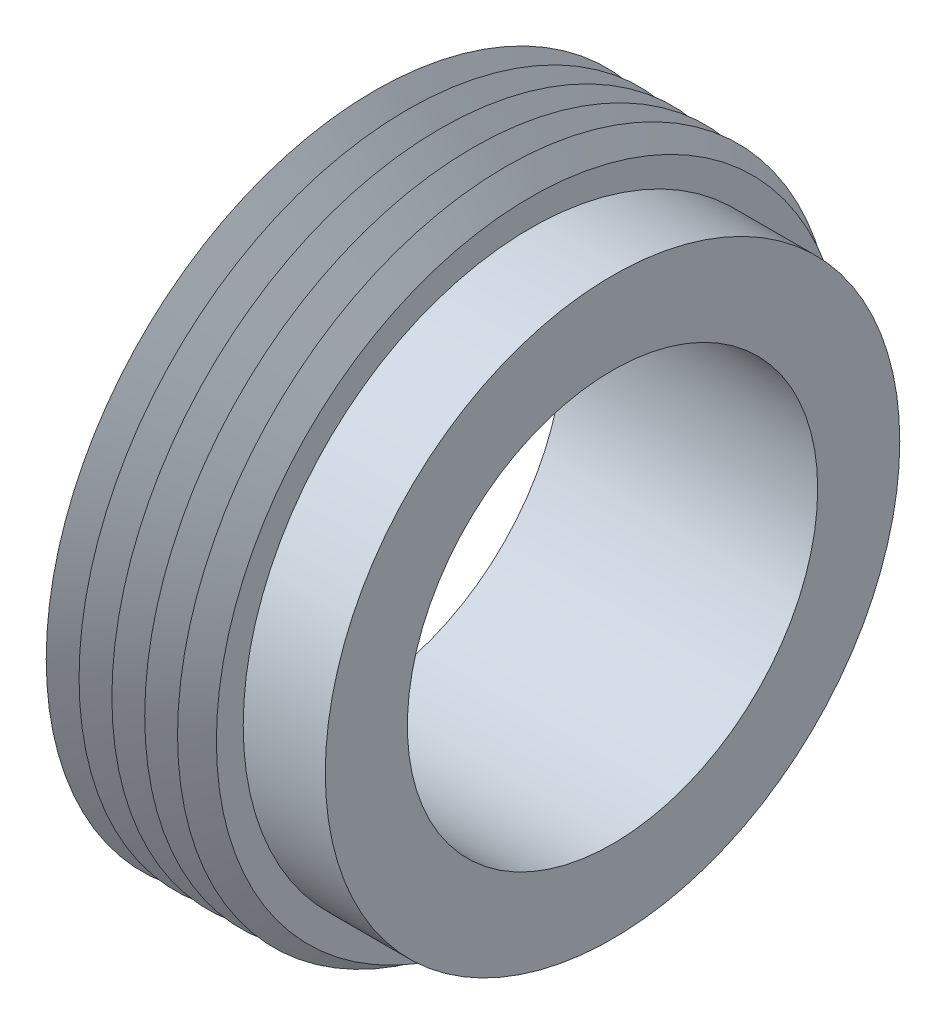
ISO-10303-21;
HEADER;
FILE_DESCRIPTION(('STEP AP214'),'2;1');
FILE_NAME('part.step','',(''),(''),'','','');
FILE_SCHEMA(('AUTOMOTIVE_DESIGN { 1 0 10303 214 1 1 1 1 }'));
ENDSEC;
DATA;
#1=APPLICATION_CONTEXT('core data for automotive mechanical design processes');
#2=APPLICATION_PROTOCOL_DEFINITION('international standard','automotive_design',2000,#1);
#3=PRODUCT_CONTEXT('',#1,'mechanical');
#4=PRODUCT('Part','Part','',(#3));
#5=PRODUCT_RELATED_PRODUCT_CATEGORY('part','',(#4));
#6=PRODUCT_DEFINITION_FORMATION('','',#4);
#7=PRODUCT_DEFINITION_CONTEXT('part definition',#1,'design');
#8=PRODUCT_DEFINITION('design','',#6,#7);
#9=PRODUCT_DEFINITION_SHAPE('','',#8);
#10=(LENGTH_UNIT() NAMED_UNIT(*) SI_UNIT(.MILLI.,.METRE.));
#11=(NAMED_UNIT(*) PLANE_ANGLE_UNIT() SI_UNIT($,.RADIAN.));
#12=(NAMED_UNIT(*) SI_UNIT($,.STERADIAN.) SOLID_ANGLE_UNIT());
#13=UNCERTAINTY_MEASURE_WITH_UNIT(LENGTH_MEASURE(1.E-05),#10,'distance_accuracy_value','');
#14=(GEOMETRIC_REPRESENTATION_CONTEXT(3) GLOBAL_UNCERTAINTY_ASSIGNED_CONTEXT((#13)) GLOBAL_UNIT_ASSIGNED_CONTEXT((#10,
#11,#12)) REPRESENTATION_CONTEXT('',''));
#15=CARTESIAN_POINT('',(0.,0.,0.));
#16=DIRECTION('',(0.,0.,1.));
#17=DIRECTION('',(1.,0.,0.));
#18=AXIS2_PLACEMENT_3D('',#15,#16,#17);
#19=CARTESIAN_POINT('',(-1.70000000002801,0.,0.));
#20=DIRECTION('',(1.,0.,0.));
#21=DIRECTION('',(0.,1.,0.));
#22=AXIS2_PLACEMENT_3D('',#19,#20,#21);
#23=CONICAL_SURFACE('',#22,4.0000000000191,1.04718484909684);
#24=CARTESIAN_POINT('',(-1.90000000003465,0.,0.));
#25=DIRECTION('',(-1.,0.,0.));
#26=DIRECTION('',(0.,0.,1.));
#27=AXIS2_PLACEMENT_3D('',#24,#25,#26);
#28=CIRCLE('',#27,3.65360000006376);
#29=CARTESIAN_POINT('',(-1.90000000003465,0.,3.65360000006376));
#30=VERTEX_POINT('',#29);
#31=EDGE_CURVE('E30',#30,#30,#28,.T.);
#32=ORIENTED_EDGE('',*,*,#31,.F.);
#33=EDGE_LOOP('',(#32));
#34=FACE_BOUND('',#33,.T.);
#35=CARTESIAN_POINT('',(-1.69999999997117,0.,0.));
#36=DIRECTION('',(-1.,0.,0.));
#37=DIRECTION('',(0.,0.,1.));
#38=AXIS2_PLACEMENT_3D('',#35,#36,#37);
#39=CIRCLE('',#38,4.0000000000191);
#40=CARTESIAN_POINT('',(-1.69999999997117,0.,4.0000000000191));
#41=VERTEX_POINT('',#40);
#42=EDGE_CURVE('E68',#41,#41,#39,.F.);
#43=ORIENTED_EDGE('',*,*,#42,.F.);
#44=EDGE_LOOP('',(#43));
#45=FACE_BOUND('',#44,.T.);
#46=ADVANCED_FACE('F15',(#34,#45),#23,.T.);
#47=CARTESIAN_POINT('',(-2.09999999998445,0.,0.));
#48=DIRECTION('',(-1.,0.,0.));
#49=DIRECTION('',(0.,0.,1.));
#50=AXIS2_PLACEMENT_3D('',#47,#48,#49);
#51=CONICAL_SURFACE('',#50,4.0000000000191,1.04718484907779);
#52=CARTESIAN_POINT('',(-2.10000000004129,0.,0.));
#53=DIRECTION('',(1.,0.,0.));
#54=DIRECTION('',(0.,0.,1.));
#55=AXIS2_PLACEMENT_3D('',#52,#53,#54);
#56=CIRCLE('',#55,4.0000000000191);
#57=CARTESIAN_POINT('',(-2.10000000004129,0.,4.0000000000191));
#58=VERTEX_POINT('',#57);
#59=EDGE_CURVE('E66',#58,#58,#56,.F.);
#60=ORIENTED_EDGE('',*,*,#59,.F.);
#61=EDGE_LOOP('',(#60));
#62=FACE_BOUND('',#61,.T.);
#63=ORIENTED_EDGE('',*,*,#31,.T.);
#64=EDGE_LOOP('',(#63));
#65=FACE_BOUND('',#64,.T.);
#66=ADVANCED_FACE('F75',(#62,#65),#51,.T.);
#67=CARTESIAN_POINT('',(-1.69999999997117,0.,0.));
#68=DIRECTION('',(-1.,0.,0.));
#69=DIRECTION('',(0.,0.,1.));
#70=AXIS2_PLACEMENT_3D('',#67,#68,#69);
#71=CONICAL_SURFACE('',#70,4.0000000000191,1.04718484907779);
#72=ORIENTED_EDGE('',*,*,#42,.T.);
#73=EDGE_LOOP('',(#72));
#74=FACE_BOUND('',#73,.T.);
#75=CARTESIAN_POINT('',(-1.50000000002137,0.,0.));
#76=DIRECTION('',(1.,0.,0.));
#77=DIRECTION('',(0.,0.,1.));
#78=AXIS2_PLACEMENT_3D('',#75,#76,#77);
#79=CIRCLE('',#78,3.65359999995007);
#80=CARTESIAN_POINT('',(-1.50000000002137,0.,3.65359999995007));
#81=VERTEX_POINT('',#80);
#82=EDGE_CURVE('E63',#81,#81,#79,.T.);
#83=ORIENTED_EDGE('',*,*,#82,.F.);
#84=EDGE_LOOP('',(#83));
#85=FACE_BOUND('',#84,.T.);
#86=ADVANCED_FACE('F83',(#74,#85),#71,.T.);
#87=CARTESIAN_POINT('',(-2.10000000004129,0.,0.));
#88=DIRECTION('',(1.,0.,0.));
#89=DIRECTION('',(0.,0.,-1.));
#90=AXIS2_PLACEMENT_3D('',#87,#88,#89);
#91=CONICAL_SURFACE('',#90,4.0000000000191,1.04718484907779);
#92=CARTESIAN_POINT('',(-2.30000000004793,0.,0.));
#93=DIRECTION('',(-1.,0.,0.));
#94=DIRECTION('',(0.,0.,1.));
#95=AXIS2_PLACEMENT_3D('',#92,#93,#94);
#96=CIRCLE('',#95,3.65360000006376);
#97=CARTESIAN_POINT('',(-2.30000000004793,0.,3.65360000006376));
#98=VERTEX_POINT('',#97);
#99=EDGE_CURVE('E60',#98,#98,#96,.T.);
#100=ORIENTED_EDGE('',*,*,#99,.F.);
#101=EDGE_LOOP('',(#100));
#102=FACE_BOUND('',#101,.T.);
#103=ORIENTED_EDGE('',*,*,#59,.T.);
#104=EDGE_LOOP('',(#103));
#105=FACE_BOUND('',#104,.T.);
#106=ADVANCED_FACE('F136',(#102,#105),#91,.T.);
#107=CARTESIAN_POINT('',(-1.30000000001473,0.,0.));
#108=DIRECTION('',(1.,0.,0.));
#109=DIRECTION('',(0.,0.,-1.));
#110=AXIS2_PLACEMENT_3D('',#107,#108,#109);
#111=CONICAL_SURFACE('',#110,4.0000000000191,1.04718484909684);
#112=ORIENTED_EDGE('',*,*,#82,.T.);
#113=EDGE_LOOP('',(#112));
#114=FACE_BOUND('',#113,.T.);
#115=CARTESIAN_POINT('',(-1.29999999995789,0.,0.));
#116=DIRECTION('',(-1.,0.,0.));
#117=DIRECTION('',(0.,0.,1.));
#118=AXIS2_PLACEMENT_3D('',#115,#116,#117);
#119=CIRCLE('',#118,4.0000000000191);
#120=CARTESIAN_POINT('',(-1.29999999995789,0.,4.0000000000191));
#121=VERTEX_POINT('',#120);
#122=EDGE_CURVE('E57',#121,#121,#119,.F.);
#123=ORIENTED_EDGE('',*,*,#122,.F.);
#124=EDGE_LOOP('',(#123));
#125=FACE_BOUND('',#124,.T.);
#126=ADVANCED_FACE('F132',(#114,#125),#111,.T.);
#127=CARTESIAN_POINT('',(-2.49999999999773,0.,0.));
#128=DIRECTION('',(-1.,0.,0.));
#129=DIRECTION('',(0.,0.,1.));
#130=AXIS2_PLACEMENT_3D('',#127,#128,#129);
#131=CONICAL_SURFACE('',#130,4.0000000000191,1.04718484907779);
#132=CARTESIAN_POINT('',(-2.49999999999773,0.,0.));
#133=DIRECTION('',(1.,0.,0.));
#134=DIRECTION('',(0.,0.,1.));
#135=AXIS2_PLACEMENT_3D('',#132,#133,#134);
#136=CIRCLE('',#135,4.0000000000191);
#137=CARTESIAN_POINT('',(-2.49999999999773,0.,4.0000000000191));
#138=VERTEX_POINT('',#137);
#139=EDGE_CURVE('E54',#138,#138,#136,.F.);
#140=ORIENTED_EDGE('',*,*,#139,.F.);
#141=EDGE_LOOP('',(#140));
#142=FACE_BOUND('',#141,.T.);
#143=ORIENTED_EDGE('',*,*,#99,.T.);
#144=EDGE_LOOP('',(#143));
#145=FACE_BOUND('',#144,.T.);
#146=ADVANCED_FACE('F128',(#142,#145),#131,.T.);
#147=CARTESIAN_POINT('',(-1.29999999995789,0.,0.));
#148=DIRECTION('',(-1.,0.,0.));
#149=DIRECTION('',(0.,0.,1.));
#150=AXIS2_PLACEMENT_3D('',#147,#148,#149);
#151=CONICAL_SURFACE('',#150,4.0000000000191,1.04718484907779);
#152=ORIENTED_EDGE('',*,*,#122,.T.);
#153=EDGE_LOOP('',(#152));
#154=FACE_BOUND('',#153,.T.);
#155=CARTESIAN_POINT('',(-1.09999999995125,0.,0.));
#156=DIRECTION('',(1.,0.,0.));
#157=DIRECTION('',(0.,0.,1.));
#158=AXIS2_PLACEMENT_3D('',#155,#156,#157);
#159=CIRCLE('',#158,3.65360000006376);
#160=CARTESIAN_POINT('',(-1.09999999995125,0.,3.65360000006376));
#161=VERTEX_POINT('',#160);
#162=EDGE_CURVE('E51',#161,#161,#159,.T.);
#163=ORIENTED_EDGE('',*,*,#162,.F.);
#164=EDGE_LOOP('',(#163));
#165=FACE_BOUND('',#164,.T.);
#166=ADVANCED_FACE('F124',(#154,#165),#151,.T.);
#167=CARTESIAN_POINT('',(-2.49999999999773,0.,0.));
#168=DIRECTION('',(1.,0.,0.));
#169=DIRECTION('',(0.,0.,-1.));
#170=AXIS2_PLACEMENT_3D('',#167,#168,#169);
#171=CONICAL_SURFACE('',#170,4.0000000000191,1.04718484907779);
#172=CARTESIAN_POINT('',(-2.70000000000437,0.,0.));
#173=DIRECTION('',(-1.,0.,0.));
#174=DIRECTION('',(0.,0.,1.));
#175=AXIS2_PLACEMENT_3D('',#172,#173,#174);
#176=CIRCLE('',#175,3.65360000006376);
#177=CARTESIAN_POINT('',(-2.70000000000437,0.,3.65360000006376));
#178=VERTEX_POINT('',#177);
#179=EDGE_CURVE('E47',#178,#178,#176,.T.);
#180=ORIENTED_EDGE('',*,*,#179,.F.);
#181=EDGE_LOOP('',(#180));
#182=FACE_BOUND('',#181,.T.);
#183=ORIENTED_EDGE('',*,*,#139,.T.);
#184=EDGE_LOOP('',(#183));
#185=FACE_BOUND('',#184,.T.);
#186=ADVANCED_FACE('F120',(#182,#185),#171,.T.);
#187=CARTESIAN_POINT('',(-1.0000000000332,0.,0.));
#188=DIRECTION('',(1.,0.,0.));
#189=DIRECTION('',(0.,0.,-1.));
#190=AXIS2_PLACEMENT_3D('',#187,#188,#189);
#191=CONICAL_SURFACE('',#190,3.82679999995617,1.04718484911076);
#192=ORIENTED_EDGE('',*,*,#162,.T.);
#193=EDGE_LOOP('',(#192));
#194=FACE_BOUND('',#193,.T.);
#195=CARTESIAN_POINT('',(-1.0000000000332,0.,0.));
#196=DIRECTION('',(1.,0.,0.));
#197=DIRECTION('',(0.,0.,-1.));
#198=AXIS2_PLACEMENT_3D('',#195,#196,#197);
#199=CIRCLE('',#198,3.82679999995617);
#200=CARTESIAN_POINT('',(-1.0000000000332,0.,-3.82679999995617));
#201=VERTEX_POINT('',#200);
#202=EDGE_CURVE('E18',#201,#201,#199,.F.);
#203=ORIENTED_EDGE('',*,*,#202,.T.);
#204=EDGE_LOOP('',(#203));
#205=FACE_BOUND('',#204,.T.);
#206=ADVANCED_FACE('F116',(#194,#205),#191,.T.);
#207=CARTESIAN_POINT('',(-2.89999999995416,0.,0.));
#208=DIRECTION('',(-1.,0.,0.));
#209=DIRECTION('',(0.,0.,1.));
#210=AXIS2_PLACEMENT_3D('',#207,#208,#209);
#211=CONICAL_SURFACE('',#210,4.0000000000191,1.04718484907779);
#212=CARTESIAN_POINT('',(-2.900000000011,0.,0.));
#213=DIRECTION('',(1.,0.,0.));
#214=DIRECTION('',(0.,0.,1.));
#215=AXIS2_PLACEMENT_3D('',#212,#213,#214);
#216=CIRCLE('',#215,4.0000000000191);
#217=CARTESIAN_POINT('',(-2.900000000011,0.,4.0000000000191));
#218=VERTEX_POINT('',#217);
#219=EDGE_CURVE('E39',#218,#218,#216,.F.);
#220=ORIENTED_EDGE('',*,*,#219,.F.);
#221=EDGE_LOOP('',(#220));
#222=FACE_BOUND('',#221,.T.);
#223=ORIENTED_EDGE('',*,*,#179,.T.);
#224=EDGE_LOOP('',(#223));
#225=FACE_BOUND('',#224,.T.);
#226=ADVANCED_FACE('F112',(#222,#225),#211,.T.);
#227=CARTESIAN_POINT('',(-1.,0.,0.));
#228=DIRECTION('',(-1.,0.,0.));
#229=DIRECTION('',(0.,0.,1.));
#230=AXIS2_PLACEMENT_3D('',#227,#228,#229);
#231=PLANE('',#230);
#232=ORIENTED_EDGE('',*,*,#202,.F.);
#233=EDGE_LOOP('',(#232));
#234=FACE_BOUND('',#233,.T.);
#235=CARTESIAN_POINT('',(-1.,0.,0.));
#236=DIRECTION('',(1.,0.,0.));
#237=DIRECTION('',(0.,0.,-1.));
#238=AXIS2_PLACEMENT_3D('',#235,#236,#237);
#239=CIRCLE('',#238,3.5);
#240=CARTESIAN_POINT('',(-1.,0.,-3.5));
#241=VERTEX_POINT('',#240);
#242=EDGE_CURVE('E37',#241,#241,#239,.T.);
#243=ORIENTED_EDGE('',*,*,#242,.F.);
#244=EDGE_LOOP('',(#243));
#245=FACE_BOUND('',#244,.T.);
#246=ADVANCED_FACE('F108',(#234,#245),#231,.F.);
#247=CARTESIAN_POINT('',(-2.90000000006785,0.,0.));
#248=DIRECTION('',(1.,0.,0.));
#249=DIRECTION('',(0.,0.,-1.));
#250=AXIS2_PLACEMENT_3D('',#247,#248,#249);
#251=CONICAL_SURFACE('',#250,3.99999999990541,1.04718484895472);
#252=CARTESIAN_POINT('',(-3.10000000000885,0.,0.));
#253=DIRECTION('',(1.,0.,0.));
#254=DIRECTION('',(0.,0.,-1.));
#255=AXIS2_PLACEMENT_3D('',#252,#253,#254);
#256=CIRCLE('',#255,3.65360000006376);
#257=CARTESIAN_POINT('',(-3.10000000000885,0.,-3.65360000006376));
#258=VERTEX_POINT('',#257);
#259=EDGE_CURVE('E35',#258,#258,#256,.T.);
#260=ORIENTED_EDGE('',*,*,#259,.T.);
#261=EDGE_LOOP('',(#260));
#262=FACE_BOUND('',#261,.T.);
#263=ORIENTED_EDGE('',*,*,#219,.T.);
#264=EDGE_LOOP('',(#263));
#265=FACE_BOUND('',#264,.T.);
#266=ADVANCED_FACE('F104',(#262,#265),#251,.T.);
#267=CARTESIAN_POINT('',(-0.5,0.,0.));
#268=DIRECTION('',(1.,0.,0.));
#269=DIRECTION('',(0.,0.,-1.));
#270=AXIS2_PLACEMENT_3D('',#267,#268,#269);
#271=CYLINDRICAL_SURFACE('',#270,3.5);
#272=CARTESIAN_POINT('',(0.,0.,0.));
#273=DIRECTION('',(1.,0.,0.));
#274=DIRECTION('',(0.,0.,-1.));
#275=AXIS2_PLACEMENT_3D('',#272,#273,#274);
#276=CIRCLE('',#275,3.5);
#277=CARTESIAN_POINT('',(0.,0.,-3.5));
#278=VERTEX_POINT('',#277);
#279=EDGE_CURVE('E27',#278,#278,#276,.T.);
#280=ORIENTED_EDGE('',*,*,#279,.F.);
#281=EDGE_LOOP('',(#280));
#282=FACE_BOUND('',#281,.T.);
#283=ORIENTED_EDGE('',*,*,#242,.T.);
#284=EDGE_LOOP('',(#283));
#285=FACE_BOUND('',#284,.T.);
#286=ADVANCED_FACE('F100',(#282,#285),#271,.T.);
#287=CARTESIAN_POINT('',(-3.1,0.,0.));
#288=DIRECTION('',(1.,0.,0.));
#289=DIRECTION('',(0.,0.,-1.));
#290=AXIS2_PLACEMENT_3D('',#287,#288,#289);
#291=PLANE('',#290);
#292=ORIENTED_EDGE('',*,*,#259,.F.);
#293=EDGE_LOOP('',(#292));
#294=FACE_BOUND('',#293,.T.);
#295=CARTESIAN_POINT('',(-3.1,0.,0.));
#296=DIRECTION('',(1.,0.,0.));
#297=DIRECTION('',(0.,0.,-1.));
#298=AXIS2_PLACEMENT_3D('',#295,#296,#297);
#299=CIRCLE('',#298,2.5);
#300=CARTESIAN_POINT('',(-3.1,0.,-2.5));
#301=VERTEX_POINT('',#300);
#302=EDGE_CURVE('E22',#301,#301,#299,.T.);
#303=ORIENTED_EDGE('',*,*,#302,.T.);
#304=EDGE_LOOP('',(#303));
#305=FACE_BOUND('',#304,.T.);
#306=ADVANCED_FACE('F93',(#294,#305),#291,.F.);
#307=CARTESIAN_POINT('',(0.,0.,3.));
#308=DIRECTION('',(1.,0.,0.));
#309=DIRECTION('',(0.,0.,-1.));
#310=AXIS2_PLACEMENT_3D('',#307,#308,#309);
#311=PLANE('',#310);
#312=ORIENTED_EDGE('',*,*,#279,.T.);
#313=EDGE_LOOP('',(#312));
#314=FACE_BOUND('',#313,.T.);
#315=CARTESIAN_POINT('',(0.,0.,0.));
#316=DIRECTION('',(1.,0.,0.));
#317=DIRECTION('',(0.,0.,-1.));
#318=AXIS2_PLACEMENT_3D('',#315,#316,#317);
#319=CIRCLE('',#318,2.5);
#320=CARTESIAN_POINT('',(0.,0.,-2.5));
#321=VERTEX_POINT('',#320);
#322=EDGE_CURVE('E10',#321,#321,#319,.F.);
#323=ORIENTED_EDGE('',*,*,#322,.T.);
#324=EDGE_LOOP('',(#323));
#325=FACE_BOUND('',#324,.T.);
#326=ADVANCED_FACE('F87',(#314,#325),#311,.T.);
#327=CARTESIAN_POINT('',(-2.05,0.,0.));
#328=DIRECTION('',(1.,0.,0.));
#329=DIRECTION('',(0.,0.,-1.));
#330=AXIS2_PLACEMENT_3D('',#327,#328,#329);
#331=CYLINDRICAL_SURFACE('',#330,2.5);
#332=ORIENTED_EDGE('',*,*,#322,.F.);
#333=EDGE_LOOP('',(#332));
#334=FACE_BOUND('',#333,.T.);
#335=ORIENTED_EDGE('',*,*,#302,.F.);
#336=EDGE_LOOP('',(#335));
#337=FACE_BOUND('',#336,.T.);
#338=ADVANCED_FACE('F85',(#334,#337),#331,.F.);
#339=CLOSED_SHELL('',(#46,#66,#86,#106,#126,#146,#166,#186,#206,#226,#246,#266,#286,#306,#326,#338));
#340=MANIFOLD_SOLID_BREP('B1',#339);
#341=ADVANCED_BREP_SHAPE_REPRESENTATION('',(#18,#340),#14);
#342=SHAPE_DEFINITION_REPRESENTATION(#9,#341);
ENDSEC;
END-ISO-10303-21;
